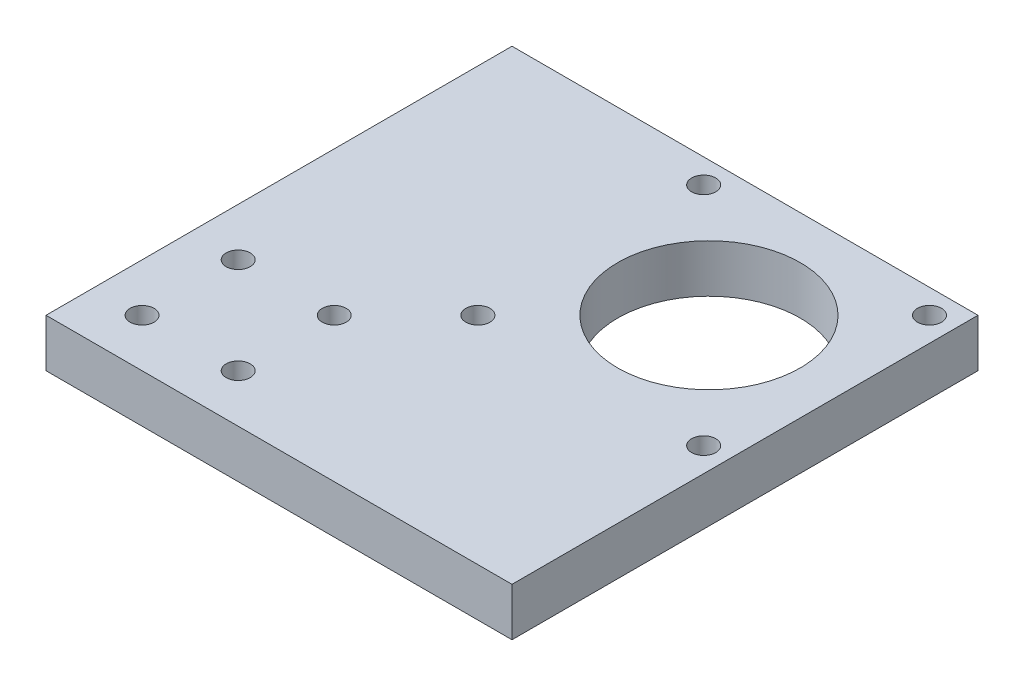
ISO-10303-21;
HEADER;
FILE_DESCRIPTION(('STEP AP214'),'2;1');
FILE_NAME('part.step','',(''),(''),'','','');
FILE_SCHEMA(('AUTOMOTIVE_DESIGN { 1 0 10303 214 1 1 1 1 }'));
ENDSEC;
DATA;
#1=APPLICATION_CONTEXT('core data for automotive mechanical design processes');
#2=APPLICATION_PROTOCOL_DEFINITION('international standard','automotive_design',2000,#1);
#3=PRODUCT_CONTEXT('',#1,'mechanical');
#4=PRODUCT('Part','Part','',(#3));
#5=PRODUCT_RELATED_PRODUCT_CATEGORY('part','',(#4));
#6=PRODUCT_DEFINITION_FORMATION('','',#4);
#7=PRODUCT_DEFINITION_CONTEXT('part definition',#1,'design');
#8=PRODUCT_DEFINITION('design','',#6,#7);
#9=PRODUCT_DEFINITION_SHAPE('','',#8);
#10=(LENGTH_UNIT() NAMED_UNIT(*) SI_UNIT(.MILLI.,.METRE.));
#11=(NAMED_UNIT(*) PLANE_ANGLE_UNIT() SI_UNIT($,.RADIAN.));
#12=(NAMED_UNIT(*) SI_UNIT($,.STERADIAN.) SOLID_ANGLE_UNIT());
#13=UNCERTAINTY_MEASURE_WITH_UNIT(LENGTH_MEASURE(1.E-05),#10,'distance_accuracy_value','');
#14=(GEOMETRIC_REPRESENTATION_CONTEXT(3) GLOBAL_UNCERTAINTY_ASSIGNED_CONTEXT((#13)) GLOBAL_UNIT_ASSIGNED_CONTEXT((#10,
#11,#12)) REPRESENTATION_CONTEXT('',''));
#15=CARTESIAN_POINT('',(0.,0.,0.));
#16=DIRECTION('',(0.,0.,1.));
#17=DIRECTION('',(1.,0.,0.));
#18=AXIS2_PLACEMENT_3D('',#15,#16,#17);
#19=CARTESIAN_POINT('',(0.,10.,-97.));
#20=DIRECTION('',(1.,0.,0.));
#21=DIRECTION('',(0.,0.,-1.));
#22=AXIS2_PLACEMENT_3D('',#19,#20,#21);
#23=PLANE('',#22);
#24=DIRECTION('',(0.,0.,1.));
#25=VECTOR('',#24,1.);
#26=CARTESIAN_POINT('',(0.,0.,-97.));
#27=LINE('',#26,#25);
#28=CARTESIAN_POINT('',(0.,0.,-97.));
#29=VERTEX_POINT('',#28);
#30=CARTESIAN_POINT('',(0.,0.,0.));
#31=VERTEX_POINT('',#30);
#32=EDGE_CURVE('E110',#29,#31,#27,.T.);
#33=ORIENTED_EDGE('',*,*,#32,.T.);
#34=DIRECTION('',(0.,-1.,0.));
#35=VECTOR('',#34,1.);
#36=CARTESIAN_POINT('',(0.,10.,0.));
#37=LINE('',#36,#35);
#38=CARTESIAN_POINT('',(0.,10.,0.));
#39=VERTEX_POINT('',#38);
#40=EDGE_CURVE('E11',#39,#31,#37,.T.);
#41=ORIENTED_EDGE('',*,*,#40,.F.);
#42=DIRECTION('',(0.,0.,1.));
#43=VECTOR('',#42,1.);
#44=CARTESIAN_POINT('',(0.,10.,-97.));
#45=LINE('',#44,#43);
#46=CARTESIAN_POINT('',(0.,10.,-97.));
#47=VERTEX_POINT('',#46);
#48=EDGE_CURVE('E94',#47,#39,#45,.T.);
#49=ORIENTED_EDGE('',*,*,#48,.F.);
#50=DIRECTION('',(0.,-1.,0.));
#51=VECTOR('',#50,1.);
#52=CARTESIAN_POINT('',(0.,10.,-97.));
#53=LINE('',#52,#51);
#54=EDGE_CURVE('E106',#47,#29,#53,.T.);
#55=ORIENTED_EDGE('',*,*,#54,.T.);
#56=EDGE_LOOP('',(#33,#41,#49,#55));
#57=FACE_BOUND('',#56,.T.);
#58=ADVANCED_FACE('F42',(#57),#23,.F.);
#59=CARTESIAN_POINT('',(0.,10.,0.));
#60=DIRECTION('',(0.,0.,-1.));
#61=DIRECTION('',(-1.,0.,0.));
#62=AXIS2_PLACEMENT_3D('',#59,#60,#61);
#63=PLANE('',#62);
#64=DIRECTION('',(1.,0.,0.));
#65=VECTOR('',#64,1.);
#66=CARTESIAN_POINT('',(0.,0.,0.));
#67=LINE('',#66,#65);
#68=CARTESIAN_POINT('',(97.,0.,0.));
#69=VERTEX_POINT('',#68);
#70=EDGE_CURVE('E99',#31,#69,#67,.T.);
#71=ORIENTED_EDGE('',*,*,#70,.T.);
#72=DIRECTION('',(0.,-1.,0.));
#73=VECTOR('',#72,1.);
#74=CARTESIAN_POINT('',(97.,10.,0.));
#75=LINE('',#74,#73);
#76=CARTESIAN_POINT('',(97.,10.,0.));
#77=VERTEX_POINT('',#76);
#78=EDGE_CURVE('E51',#77,#69,#75,.T.);
#79=ORIENTED_EDGE('',*,*,#78,.F.);
#80=DIRECTION('',(1.,0.,0.));
#81=VECTOR('',#80,1.);
#82=CARTESIAN_POINT('',(0.,10.,0.));
#83=LINE('',#82,#81);
#84=EDGE_CURVE('E89',#39,#77,#83,.T.);
#85=ORIENTED_EDGE('',*,*,#84,.F.);
#86=ORIENTED_EDGE('',*,*,#40,.T.);
#87=EDGE_LOOP('',(#71,#79,#85,#86));
#88=FACE_BOUND('',#87,.T.);
#89=ADVANCED_FACE('F98',(#88),#63,.F.);
#90=CARTESIAN_POINT('',(97.,10.,0.));
#91=DIRECTION('',(-1.,0.,0.));
#92=DIRECTION('',(0.,0.,1.));
#93=AXIS2_PLACEMENT_3D('',#90,#91,#92);
#94=PLANE('',#93);
#95=DIRECTION('',(0.,0.,-1.));
#96=VECTOR('',#95,1.);
#97=CARTESIAN_POINT('',(97.,0.,0.));
#98=LINE('',#97,#96);
#99=CARTESIAN_POINT('',(97.,0.,-97.));
#100=VERTEX_POINT('',#99);
#101=EDGE_CURVE('E76',#69,#100,#98,.T.);
#102=ORIENTED_EDGE('',*,*,#101,.T.);
#103=DIRECTION('',(0.,-1.,0.));
#104=VECTOR('',#103,1.);
#105=CARTESIAN_POINT('',(97.,10.,-97.));
#106=LINE('',#105,#104);
#107=CARTESIAN_POINT('',(97.,10.,-97.));
#108=VERTEX_POINT('',#107);
#109=EDGE_CURVE('E101',#108,#100,#106,.T.);
#110=ORIENTED_EDGE('',*,*,#109,.F.);
#111=DIRECTION('',(0.,0.,-1.));
#112=VECTOR('',#111,1.);
#113=CARTESIAN_POINT('',(97.,10.,0.));
#114=LINE('',#113,#112);
#115=EDGE_CURVE('E92',#77,#108,#114,.T.);
#116=ORIENTED_EDGE('',*,*,#115,.F.);
#117=ORIENTED_EDGE('',*,*,#78,.T.);
#118=EDGE_LOOP('',(#102,#110,#116,#117));
#119=FACE_BOUND('',#118,.T.);
#120=ADVANCED_FACE('F102',(#119),#94,.F.);
#121=CARTESIAN_POINT('',(97.,10.,-97.));
#122=DIRECTION('',(0.,0.,1.));
#123=DIRECTION('',(1.,0.,0.));
#124=AXIS2_PLACEMENT_3D('',#121,#122,#123);
#125=PLANE('',#124);
#126=DIRECTION('',(-1.,0.,0.));
#127=VECTOR('',#126,1.);
#128=CARTESIAN_POINT('',(97.,0.,-97.));
#129=LINE('',#128,#127);
#130=EDGE_CURVE('E82',#100,#29,#129,.T.);
#131=ORIENTED_EDGE('',*,*,#130,.T.);
#132=ORIENTED_EDGE('',*,*,#54,.F.);
#133=DIRECTION('',(-1.,0.,0.));
#134=VECTOR('',#133,1.);
#135=CARTESIAN_POINT('',(97.,10.,-97.));
#136=LINE('',#135,#134);
#137=EDGE_CURVE('E59',#108,#47,#136,.T.);
#138=ORIENTED_EDGE('',*,*,#137,.F.);
#139=ORIENTED_EDGE('',*,*,#109,.T.);
#140=EDGE_LOOP('',(#131,#132,#138,#139));
#141=FACE_BOUND('',#140,.T.);
#142=ADVANCED_FACE('F124',(#141),#125,.F.);
#143=CARTESIAN_POINT('',(0.,10.,0.));
#144=DIRECTION('',(0.,1.,0.));
#145=DIRECTION('',(0.,0.,1.));
#146=AXIS2_PLACEMENT_3D('',#143,#144,#145);
#147=PLANE('',#146);
#148=CARTESIAN_POINT('',(10.,10.,-30.));
#149=DIRECTION('',(0.,1.,0.));
#150=DIRECTION('',(0.,0.,1.));
#151=AXIS2_PLACEMENT_3D('',#148,#149,#150);
#152=CIRCLE('',#151,2.5);
#153=CARTESIAN_POINT('',(10.,10.,-27.5));
#154=VERTEX_POINT('',#153);
#155=EDGE_CURVE('E143',#154,#154,#152,.T.);
#156=ORIENTED_EDGE('',*,*,#155,.F.);
#157=EDGE_LOOP('',(#156));
#158=FACE_BOUND('',#157,.T.);
#159=CARTESIAN_POINT('',(10.,10.,-10.));
#160=DIRECTION('',(0.,1.,0.));
#161=DIRECTION('',(0.,0.,1.));
#162=AXIS2_PLACEMENT_3D('',#159,#160,#161);
#163=CIRCLE('',#162,2.5);
#164=CARTESIAN_POINT('',(10.,10.,-7.5));
#165=VERTEX_POINT('',#164);
#166=EDGE_CURVE('E151',#165,#165,#163,.T.);
#167=ORIENTED_EDGE('',*,*,#166,.F.);
#168=EDGE_LOOP('',(#167));
#169=FACE_BOUND('',#168,.T.);
#170=CARTESIAN_POINT('',(30.,10.,-30.));
#171=DIRECTION('',(0.,1.,0.));
#172=DIRECTION('',(0.,0.,1.));
#173=AXIS2_PLACEMENT_3D('',#170,#171,#172);
#174=CIRCLE('',#173,2.50000000000001);
#175=CARTESIAN_POINT('',(30.,10.,-27.5));
#176=VERTEX_POINT('',#175);
#177=EDGE_CURVE('E159',#176,#176,#174,.T.);
#178=ORIENTED_EDGE('',*,*,#177,.F.);
#179=EDGE_LOOP('',(#178));
#180=FACE_BOUND('',#179,.T.);
#181=CARTESIAN_POINT('',(30.,10.,-10.));
#182=DIRECTION('',(0.,1.,0.));
#183=DIRECTION('',(0.,0.,1.));
#184=AXIS2_PLACEMENT_3D('',#181,#182,#183);
#185=CIRCLE('',#184,2.5);
#186=CARTESIAN_POINT('',(30.,10.,-7.5));
#187=VERTEX_POINT('',#186);
#188=EDGE_CURVE('E167',#187,#187,#185,.T.);
#189=ORIENTED_EDGE('',*,*,#188,.F.);
#190=EDGE_LOOP('',(#189));
#191=FACE_BOUND('',#190,.T.);
#192=CARTESIAN_POINT('',(44.95,10.,-44.95));
#193=DIRECTION('',(0.,1.,0.));
#194=DIRECTION('',(0.,0.,1.));
#195=AXIS2_PLACEMENT_3D('',#192,#193,#194);
#196=CIRCLE('',#195,2.51);
#197=CARTESIAN_POINT('',(44.95,10.,-42.44));
#198=VERTEX_POINT('',#197);
#199=EDGE_CURVE('E175',#198,#198,#196,.T.);
#200=ORIENTED_EDGE('',*,*,#199,.F.);
#201=EDGE_LOOP('',(#200));
#202=FACE_BOUND('',#201,.T.);
#203=CARTESIAN_POINT('',(91.95,10.,-44.95));
#204=DIRECTION('',(0.,1.,0.));
#205=DIRECTION('',(0.,0.,1.));
#206=AXIS2_PLACEMENT_3D('',#203,#204,#205);
#207=CIRCLE('',#206,2.50999999999999);
#208=CARTESIAN_POINT('',(91.95,10.,-42.44));
#209=VERTEX_POINT('',#208);
#210=EDGE_CURVE('E183',#209,#209,#207,.T.);
#211=ORIENTED_EDGE('',*,*,#210,.F.);
#212=EDGE_LOOP('',(#211));
#213=FACE_BOUND('',#212,.T.);
#214=CARTESIAN_POINT('',(91.95,10.,-91.95));
#215=DIRECTION('',(0.,1.,0.));
#216=DIRECTION('',(0.,0.,1.));
#217=AXIS2_PLACEMENT_3D('',#214,#215,#216);
#218=CIRCLE('',#217,2.50999999999999);
#219=CARTESIAN_POINT('',(91.95,10.,-89.44));
#220=VERTEX_POINT('',#219);
#221=EDGE_CURVE('E191',#220,#220,#218,.T.);
#222=ORIENTED_EDGE('',*,*,#221,.F.);
#223=EDGE_LOOP('',(#222));
#224=FACE_BOUND('',#223,.T.);
#225=CARTESIAN_POINT('',(44.95,10.,-91.95));
#226=DIRECTION('',(0.,1.,0.));
#227=DIRECTION('',(0.,0.,1.));
#228=AXIS2_PLACEMENT_3D('',#225,#226,#227);
#229=CIRCLE('',#228,2.51);
#230=CARTESIAN_POINT('',(44.95,10.,-89.44));
#231=VERTEX_POINT('',#230);
#232=EDGE_CURVE('E135',#231,#231,#229,.T.);
#233=ORIENTED_EDGE('',*,*,#232,.F.);
#234=EDGE_LOOP('',(#233));
#235=FACE_BOUND('',#234,.T.);
#236=CARTESIAN_POINT('',(69.,10.,-69.));
#237=DIRECTION('',(0.,1.,0.));
#238=DIRECTION('',(0.,0.,1.));
#239=AXIS2_PLACEMENT_3D('',#236,#237,#238);
#240=CIRCLE('',#239,19.);
#241=CARTESIAN_POINT('',(69.,10.,-50.));
#242=VERTEX_POINT('',#241);
#243=EDGE_CURVE('E131',#242,#242,#240,.T.);
#244=ORIENTED_EDGE('',*,*,#243,.F.);
#245=EDGE_LOOP('',(#244));
#246=FACE_BOUND('',#245,.T.);
#247=ORIENTED_EDGE('',*,*,#48,.T.);
#248=ORIENTED_EDGE('',*,*,#84,.T.);
#249=ORIENTED_EDGE('',*,*,#115,.T.);
#250=ORIENTED_EDGE('',*,*,#137,.T.);
#251=EDGE_LOOP('',(#247,#248,#249,#250));
#252=FACE_BOUND('',#251,.T.);
#253=ADVANCED_FACE('F90',(#158,#169,#180,#191,#202,#213,#224,#235,#246,#252),#147,.T.);
#254=CARTESIAN_POINT('',(0.,0.,0.));
#255=DIRECTION('',(0.,1.,0.));
#256=DIRECTION('',(0.,0.,1.));
#257=AXIS2_PLACEMENT_3D('',#254,#255,#256);
#258=PLANE('',#257);
#259=CARTESIAN_POINT('',(10.,0.,-30.));
#260=DIRECTION('',(0.,1.,0.));
#261=DIRECTION('',(0.,0.,1.));
#262=AXIS2_PLACEMENT_3D('',#259,#260,#261);
#263=CIRCLE('',#262,2.5);
#264=CARTESIAN_POINT('',(10.,0.,-27.5));
#265=VERTEX_POINT('',#264);
#266=EDGE_CURVE('E139',#265,#265,#263,.T.);
#267=ORIENTED_EDGE('',*,*,#266,.T.);
#268=EDGE_LOOP('',(#267));
#269=FACE_BOUND('',#268,.T.);
#270=CARTESIAN_POINT('',(10.,0.,-10.));
#271=DIRECTION('',(0.,1.,0.));
#272=DIRECTION('',(0.,0.,1.));
#273=AXIS2_PLACEMENT_3D('',#270,#271,#272);
#274=CIRCLE('',#273,2.5);
#275=CARTESIAN_POINT('',(10.,0.,-7.5));
#276=VERTEX_POINT('',#275);
#277=EDGE_CURVE('E147',#276,#276,#274,.T.);
#278=ORIENTED_EDGE('',*,*,#277,.T.);
#279=EDGE_LOOP('',(#278));
#280=FACE_BOUND('',#279,.T.);
#281=CARTESIAN_POINT('',(30.,0.,-30.));
#282=DIRECTION('',(0.,1.,0.));
#283=DIRECTION('',(0.,0.,1.));
#284=AXIS2_PLACEMENT_3D('',#281,#282,#283);
#285=CIRCLE('',#284,2.50000000000001);
#286=CARTESIAN_POINT('',(30.,0.,-27.5));
#287=VERTEX_POINT('',#286);
#288=EDGE_CURVE('E155',#287,#287,#285,.T.);
#289=ORIENTED_EDGE('',*,*,#288,.T.);
#290=EDGE_LOOP('',(#289));
#291=FACE_BOUND('',#290,.T.);
#292=CARTESIAN_POINT('',(30.,0.,-10.));
#293=DIRECTION('',(0.,1.,0.));
#294=DIRECTION('',(0.,0.,1.));
#295=AXIS2_PLACEMENT_3D('',#292,#293,#294);
#296=CIRCLE('',#295,2.5);
#297=CARTESIAN_POINT('',(30.,0.,-7.5));
#298=VERTEX_POINT('',#297);
#299=EDGE_CURVE('E163',#298,#298,#296,.T.);
#300=ORIENTED_EDGE('',*,*,#299,.T.);
#301=EDGE_LOOP('',(#300));
#302=FACE_BOUND('',#301,.T.);
#303=CARTESIAN_POINT('',(44.95,0.,-44.95));
#304=DIRECTION('',(0.,1.,0.));
#305=DIRECTION('',(0.,0.,1.));
#306=AXIS2_PLACEMENT_3D('',#303,#304,#305);
#307=CIRCLE('',#306,2.51);
#308=CARTESIAN_POINT('',(44.95,0.,-42.44));
#309=VERTEX_POINT('',#308);
#310=EDGE_CURVE('E171',#309,#309,#307,.T.);
#311=ORIENTED_EDGE('',*,*,#310,.T.);
#312=EDGE_LOOP('',(#311));
#313=FACE_BOUND('',#312,.T.);
#314=CARTESIAN_POINT('',(91.95,0.,-44.95));
#315=DIRECTION('',(0.,1.,0.));
#316=DIRECTION('',(0.,0.,1.));
#317=AXIS2_PLACEMENT_3D('',#314,#315,#316);
#318=CIRCLE('',#317,2.50999999999999);
#319=CARTESIAN_POINT('',(91.95,0.,-42.44));
#320=VERTEX_POINT('',#319);
#321=EDGE_CURVE('E179',#320,#320,#318,.T.);
#322=ORIENTED_EDGE('',*,*,#321,.T.);
#323=EDGE_LOOP('',(#322));
#324=FACE_BOUND('',#323,.T.);
#325=CARTESIAN_POINT('',(91.95,0.,-91.95));
#326=DIRECTION('',(0.,1.,0.));
#327=DIRECTION('',(0.,0.,1.));
#328=AXIS2_PLACEMENT_3D('',#325,#326,#327);
#329=CIRCLE('',#328,2.50999999999999);
#330=CARTESIAN_POINT('',(91.95,0.,-89.44));
#331=VERTEX_POINT('',#330);
#332=EDGE_CURVE('E187',#331,#331,#329,.T.);
#333=ORIENTED_EDGE('',*,*,#332,.T.);
#334=EDGE_LOOP('',(#333));
#335=FACE_BOUND('',#334,.T.);
#336=CARTESIAN_POINT('',(44.95,0.,-91.95));
#337=DIRECTION('',(0.,1.,0.));
#338=DIRECTION('',(0.,0.,1.));
#339=AXIS2_PLACEMENT_3D('',#336,#337,#338);
#340=CIRCLE('',#339,2.51);
#341=CARTESIAN_POINT('',(44.95,0.,-89.44));
#342=VERTEX_POINT('',#341);
#343=EDGE_CURVE('E195',#342,#342,#340,.T.);
#344=ORIENTED_EDGE('',*,*,#343,.T.);
#345=EDGE_LOOP('',(#344));
#346=FACE_BOUND('',#345,.T.);
#347=CARTESIAN_POINT('',(69.,0.,-69.));
#348=DIRECTION('',(0.,1.,0.));
#349=DIRECTION('',(0.,0.,1.));
#350=AXIS2_PLACEMENT_3D('',#347,#348,#349);
#351=CIRCLE('',#350,19.);
#352=CARTESIAN_POINT('',(69.,0.,-50.));
#353=VERTEX_POINT('',#352);
#354=EDGE_CURVE('E114',#353,#353,#351,.T.);
#355=ORIENTED_EDGE('',*,*,#354,.T.);
#356=EDGE_LOOP('',(#355));
#357=FACE_BOUND('',#356,.T.);
#358=ORIENTED_EDGE('',*,*,#32,.F.);
#359=ORIENTED_EDGE('',*,*,#130,.F.);
#360=ORIENTED_EDGE('',*,*,#101,.F.);
#361=ORIENTED_EDGE('',*,*,#70,.F.);
#362=EDGE_LOOP('',(#358,#359,#360,#361));
#363=FACE_BOUND('',#362,.T.);
#364=ADVANCED_FACE('F127',(#269,#280,#291,#302,#313,#324,#335,#346,#357,#363),#258,.F.);
#365=CARTESIAN_POINT('',(69.,0.,-69.));
#366=DIRECTION('',(0.,1.,0.));
#367=DIRECTION('',(0.,0.,1.));
#368=AXIS2_PLACEMENT_3D('',#365,#366,#367);
#369=CYLINDRICAL_SURFACE('',#368,19.);
#370=ORIENTED_EDGE('',*,*,#354,.F.);
#371=EDGE_LOOP('',(#370));
#372=FACE_BOUND('',#371,.T.);
#373=ORIENTED_EDGE('',*,*,#243,.T.);
#374=EDGE_LOOP('',(#373));
#375=FACE_BOUND('',#374,.T.);
#376=ADVANCED_FACE('F211',(#372,#375),#369,.F.);
#377=CARTESIAN_POINT('',(44.95,0.,-91.95));
#378=DIRECTION('',(0.,1.,0.));
#379=DIRECTION('',(0.,0.,1.));
#380=AXIS2_PLACEMENT_3D('',#377,#378,#379);
#381=CYLINDRICAL_SURFACE('',#380,2.51);
#382=ORIENTED_EDGE('',*,*,#343,.F.);
#383=EDGE_LOOP('',(#382));
#384=FACE_BOUND('',#383,.T.);
#385=ORIENTED_EDGE('',*,*,#232,.T.);
#386=EDGE_LOOP('',(#385));
#387=FACE_BOUND('',#386,.T.);
#388=ADVANCED_FACE('F203',(#384,#387),#381,.F.);
#389=CARTESIAN_POINT('',(91.95,0.,-91.95));
#390=DIRECTION('',(0.,1.,0.));
#391=DIRECTION('',(0.,0.,1.));
#392=AXIS2_PLACEMENT_3D('',#389,#390,#391);
#393=CYLINDRICAL_SURFACE('',#392,2.50999999999999);
#394=ORIENTED_EDGE('',*,*,#332,.F.);
#395=EDGE_LOOP('',(#394));
#396=FACE_BOUND('',#395,.T.);
#397=ORIENTED_EDGE('',*,*,#221,.T.);
#398=EDGE_LOOP('',(#397));
#399=FACE_BOUND('',#398,.T.);
#400=ADVANCED_FACE('F219',(#396,#399),#393,.F.);
#401=CARTESIAN_POINT('',(91.95,0.,-44.95));
#402=DIRECTION('',(0.,1.,0.));
#403=DIRECTION('',(0.,0.,1.));
#404=AXIS2_PLACEMENT_3D('',#401,#402,#403);
#405=CYLINDRICAL_SURFACE('',#404,2.50999999999999);
#406=ORIENTED_EDGE('',*,*,#321,.F.);
#407=EDGE_LOOP('',(#406));
#408=FACE_BOUND('',#407,.T.);
#409=ORIENTED_EDGE('',*,*,#210,.T.);
#410=EDGE_LOOP('',(#409));
#411=FACE_BOUND('',#410,.T.);
#412=ADVANCED_FACE('F273',(#408,#411),#405,.F.);
#413=CARTESIAN_POINT('',(44.95,0.,-44.95));
#414=DIRECTION('',(0.,1.,0.));
#415=DIRECTION('',(0.,0.,1.));
#416=AXIS2_PLACEMENT_3D('',#413,#414,#415);
#417=CYLINDRICAL_SURFACE('',#416,2.51);
#418=ORIENTED_EDGE('',*,*,#310,.F.);
#419=EDGE_LOOP('',(#418));
#420=FACE_BOUND('',#419,.T.);
#421=ORIENTED_EDGE('',*,*,#199,.T.);
#422=EDGE_LOOP('',(#421));
#423=FACE_BOUND('',#422,.T.);
#424=ADVANCED_FACE('F284',(#420,#423),#417,.F.);
#425=CARTESIAN_POINT('',(30.,0.,-10.));
#426=DIRECTION('',(0.,1.,0.));
#427=DIRECTION('',(0.,0.,1.));
#428=AXIS2_PLACEMENT_3D('',#425,#426,#427);
#429=CYLINDRICAL_SURFACE('',#428,2.5);
#430=ORIENTED_EDGE('',*,*,#299,.F.);
#431=EDGE_LOOP('',(#430));
#432=FACE_BOUND('',#431,.T.);
#433=ORIENTED_EDGE('',*,*,#188,.T.);
#434=EDGE_LOOP('',(#433));
#435=FACE_BOUND('',#434,.T.);
#436=ADVANCED_FACE('F295',(#432,#435),#429,.F.);
#437=CARTESIAN_POINT('',(30.,0.,-30.));
#438=DIRECTION('',(0.,1.,0.));
#439=DIRECTION('',(0.,0.,1.));
#440=AXIS2_PLACEMENT_3D('',#437,#438,#439);
#441=CYLINDRICAL_SURFACE('',#440,2.50000000000001);
#442=ORIENTED_EDGE('',*,*,#288,.F.);
#443=EDGE_LOOP('',(#442));
#444=FACE_BOUND('',#443,.T.);
#445=ORIENTED_EDGE('',*,*,#177,.T.);
#446=EDGE_LOOP('',(#445));
#447=FACE_BOUND('',#446,.T.);
#448=ADVANCED_FACE('F306',(#444,#447),#441,.F.);
#449=CARTESIAN_POINT('',(10.,0.,-10.));
#450=DIRECTION('',(0.,1.,0.));
#451=DIRECTION('',(0.,0.,1.));
#452=AXIS2_PLACEMENT_3D('',#449,#450,#451);
#453=CYLINDRICAL_SURFACE('',#452,2.5);
#454=ORIENTED_EDGE('',*,*,#277,.F.);
#455=EDGE_LOOP('',(#454));
#456=FACE_BOUND('',#455,.T.);
#457=ORIENTED_EDGE('',*,*,#166,.T.);
#458=EDGE_LOOP('',(#457));
#459=FACE_BOUND('',#458,.T.);
#460=ADVANCED_FACE('F317',(#456,#459),#453,.F.);
#461=CARTESIAN_POINT('',(10.,0.,-30.));
#462=DIRECTION('',(0.,1.,0.));
#463=DIRECTION('',(0.,0.,1.));
#464=AXIS2_PLACEMENT_3D('',#461,#462,#463);
#465=CYLINDRICAL_SURFACE('',#464,2.5);
#466=ORIENTED_EDGE('',*,*,#266,.F.);
#467=EDGE_LOOP('',(#466));
#468=FACE_BOUND('',#467,.T.);
#469=ORIENTED_EDGE('',*,*,#155,.T.);
#470=EDGE_LOOP('',(#469));
#471=FACE_BOUND('',#470,.T.);
#472=ADVANCED_FACE('F328',(#468,#471),#465,.F.);
#473=CLOSED_SHELL('',(#58,#89,#120,#142,#253,#364,#376,#388,#400,#412,#424,#436,#448,#460,#472));
#474=MANIFOLD_SOLID_BREP('B2',#473);
#475=ADVANCED_BREP_SHAPE_REPRESENTATION('',(#18,#474),#14);
#476=SHAPE_DEFINITION_REPRESENTATION(#9,#475);
ENDSEC;
END-ISO-10303-21;
